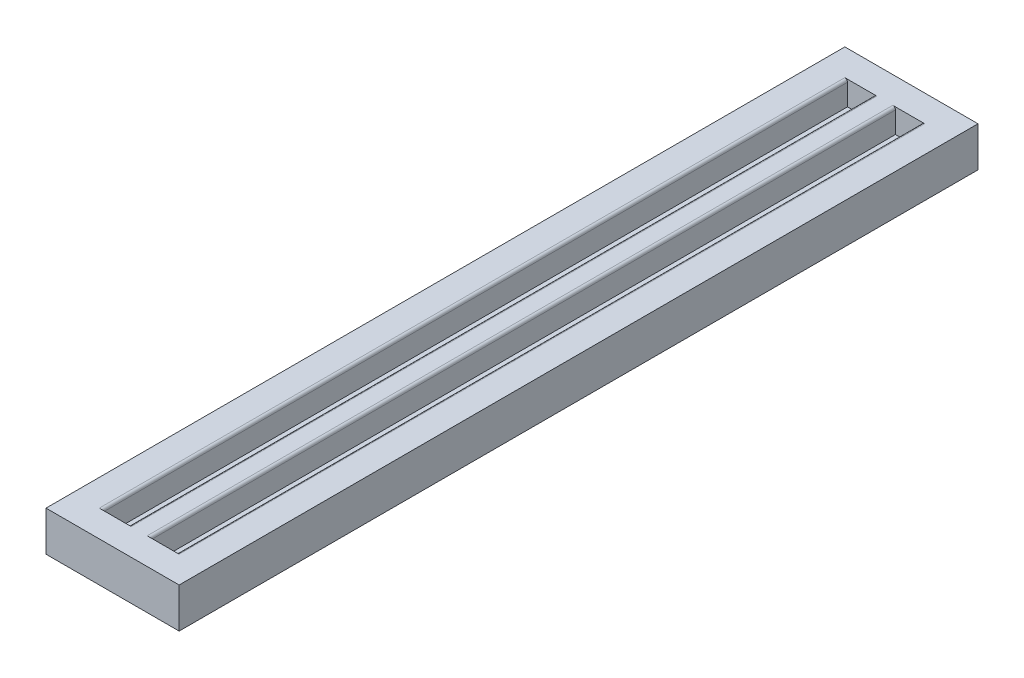
ISO-10303-21;
HEADER;
FILE_DESCRIPTION(('STEP AP214'),'2;1');
FILE_NAME('part.step','',(''),(''),'','','');
FILE_SCHEMA(('AUTOMOTIVE_DESIGN { 1 0 10303 214 1 1 1 1 }'));
ENDSEC;
DATA;
#1=APPLICATION_CONTEXT('core data for automotive mechanical design processes');
#2=APPLICATION_PROTOCOL_DEFINITION('international standard','automotive_design',2000,#1);
#3=PRODUCT_CONTEXT('',#1,'mechanical');
#4=PRODUCT('Part','Part','',(#3));
#5=PRODUCT_RELATED_PRODUCT_CATEGORY('part','',(#4));
#6=PRODUCT_DEFINITION_FORMATION('','',#4);
#7=PRODUCT_DEFINITION_CONTEXT('part definition',#1,'design');
#8=PRODUCT_DEFINITION('design','',#6,#7);
#9=PRODUCT_DEFINITION_SHAPE('','',#8);
#10=(LENGTH_UNIT() NAMED_UNIT(*) SI_UNIT(.MILLI.,.METRE.));
#11=(NAMED_UNIT(*) PLANE_ANGLE_UNIT() SI_UNIT($,.RADIAN.));
#12=(NAMED_UNIT(*) SI_UNIT($,.STERADIAN.) SOLID_ANGLE_UNIT());
#13=UNCERTAINTY_MEASURE_WITH_UNIT(LENGTH_MEASURE(1.E-05),#10,'distance_accuracy_value','');
#14=(GEOMETRIC_REPRESENTATION_CONTEXT(3) GLOBAL_UNCERTAINTY_ASSIGNED_CONTEXT((#13)) GLOBAL_UNIT_ASSIGNED_CONTEXT((#10,
#11,#12)) REPRESENTATION_CONTEXT('',''));
#15=CARTESIAN_POINT('',(0.,0.,0.));
#16=DIRECTION('',(0.,0.,1.));
#17=DIRECTION('',(1.,0.,0.));
#18=AXIS2_PLACEMENT_3D('',#15,#16,#17);
#19=CARTESIAN_POINT('',(125.,37.5,750.));
#20=DIRECTION('',(0.,-1.,0.));
#21=DIRECTION('',(1.,0.,0.));
#22=AXIS2_PLACEMENT_3D('',#19,#20,#21);
#23=PLANE('',#22);
#24=DIRECTION('',(0.,0.,1.));
#25=VECTOR('',#24,1.);
#26=CARTESIAN_POINT('',(-15.,37.5,750.));
#27=LINE('',#26,#25);
#28=CARTESIAN_POINT('',(-15.,37.5,-700.));
#29=VERTEX_POINT('',#28);
#30=CARTESIAN_POINT('',(-15.,37.5,700.));
#31=VERTEX_POINT('',#30);
#32=EDGE_CURVE('E246',#29,#31,#27,.T.);
#33=ORIENTED_EDGE('',*,*,#32,.T.);
#34=DIRECTION('',(-1.,0.,0.));
#35=VECTOR('',#34,1.);
#36=CARTESIAN_POINT('',(-70.,37.5,700.));
#37=LINE('',#36,#35);
#38=CARTESIAN_POINT('',(-75.,37.5,700.));
#39=VERTEX_POINT('',#38);
#40=EDGE_CURVE('E192',#31,#39,#37,.T.);
#41=ORIENTED_EDGE('',*,*,#40,.T.);
#42=DIRECTION('',(0.,0.,1.));
#43=VECTOR('',#42,1.);
#44=CARTESIAN_POINT('',(-75.,37.5,750.));
#45=LINE('',#44,#43);
#46=CARTESIAN_POINT('',(-75.,37.5,-700.));
#47=VERTEX_POINT('',#46);
#48=EDGE_CURVE('E243',#39,#47,#45,.F.);
#49=ORIENTED_EDGE('',*,*,#48,.T.);
#50=DIRECTION('',(-1.,0.,0.));
#51=VECTOR('',#50,1.);
#52=CARTESIAN_POINT('',(-70.,37.5,-700.));
#53=LINE('',#52,#51);
#54=EDGE_CURVE('E198',#29,#47,#53,.T.);
#55=ORIENTED_EDGE('',*,*,#54,.F.);
#56=EDGE_LOOP('',(#33,#41,#49,#55));
#57=FACE_BOUND('',#56,.T.);
#58=DIRECTION('',(-1.,0.,0.));
#59=VECTOR('',#58,1.);
#60=CARTESIAN_POINT('',(125.,37.5,-750.));
#61=LINE('',#60,#59);
#62=CARTESIAN_POINT('',(125.,37.5,-750.));
#63=VERTEX_POINT('',#62);
#64=CARTESIAN_POINT('',(-125.,37.5,-750.));
#65=VERTEX_POINT('',#64);
#66=EDGE_CURVE('E218',#63,#65,#61,.T.);
#67=ORIENTED_EDGE('',*,*,#66,.T.);
#68=DIRECTION('',(0.,0.,-1.));
#69=VECTOR('',#68,1.);
#70=CARTESIAN_POINT('',(-125.,37.5,750.));
#71=LINE('',#70,#69);
#72=CARTESIAN_POINT('',(-125.,37.5,750.));
#73=VERTEX_POINT('',#72);
#74=EDGE_CURVE('E224',#73,#65,#71,.T.);
#75=ORIENTED_EDGE('',*,*,#74,.F.);
#76=DIRECTION('',(-1.,0.,0.));
#77=VECTOR('',#76,1.);
#78=CARTESIAN_POINT('',(125.,37.5,750.));
#79=LINE('',#78,#77);
#80=CARTESIAN_POINT('',(125.,37.5,750.));
#81=VERTEX_POINT('',#80);
#82=EDGE_CURVE('E222',#81,#73,#79,.T.);
#83=ORIENTED_EDGE('',*,*,#82,.F.);
#84=DIRECTION('',(0.,0.,-1.));
#85=VECTOR('',#84,1.);
#86=CARTESIAN_POINT('',(125.,37.5,750.));
#87=LINE('',#86,#85);
#88=EDGE_CURVE('E234',#81,#63,#87,.T.);
#89=ORIENTED_EDGE('',*,*,#88,.T.);
#90=EDGE_LOOP('',(#67,#75,#83,#89));
#91=FACE_BOUND('',#90,.T.);
#92=DIRECTION('',(0.,0.,1.));
#93=VECTOR('',#92,1.);
#94=CARTESIAN_POINT('',(75.,37.5,750.));
#95=LINE('',#94,#93);
#96=CARTESIAN_POINT('',(75.,37.5,-700.));
#97=VERTEX_POINT('',#96);
#98=CARTESIAN_POINT('',(75.,37.5,700.));
#99=VERTEX_POINT('',#98);
#100=EDGE_CURVE('E252',#97,#99,#95,.T.);
#101=ORIENTED_EDGE('',*,*,#100,.T.);
#102=DIRECTION('',(-1.,0.,0.));
#103=VECTOR('',#102,1.);
#104=CARTESIAN_POINT('',(20.,37.5,700.));
#105=LINE('',#104,#103);
#106=CARTESIAN_POINT('',(15.,37.5,700.));
#107=VERTEX_POINT('',#106);
#108=EDGE_CURVE('E160',#99,#107,#105,.T.);
#109=ORIENTED_EDGE('',*,*,#108,.T.);
#110=DIRECTION('',(0.,0.,1.));
#111=VECTOR('',#110,1.);
#112=CARTESIAN_POINT('',(15.,37.5,750.));
#113=LINE('',#112,#111);
#114=CARTESIAN_POINT('',(15.,37.5,-700.));
#115=VERTEX_POINT('',#114);
#116=EDGE_CURVE('E249',#107,#115,#113,.F.);
#117=ORIENTED_EDGE('',*,*,#116,.T.);
#118=DIRECTION('',(-1.,0.,0.));
#119=VECTOR('',#118,1.);
#120=CARTESIAN_POINT('',(20.,37.5,-700.));
#121=LINE('',#120,#119);
#122=EDGE_CURVE('E171',#97,#115,#121,.T.);
#123=ORIENTED_EDGE('',*,*,#122,.F.);
#124=EDGE_LOOP('',(#101,#109,#117,#123));
#125=FACE_BOUND('',#124,.T.);
#126=ADVANCED_FACE('F37',(#57,#91,#125),#23,.F.);
#127=CARTESIAN_POINT('',(-125.,37.5,750.));
#128=DIRECTION('',(1.,0.,0.));
#129=DIRECTION('',(0.,0.,-1.));
#130=AXIS2_PLACEMENT_3D('',#127,#128,#129);
#131=PLANE('',#130);
#132=DIRECTION('',(0.,-1.,0.));
#133=VECTOR('',#132,1.);
#134=CARTESIAN_POINT('',(-125.,37.5,-750.));
#135=LINE('',#134,#133);
#136=CARTESIAN_POINT('',(-125.,-37.5,-750.));
#137=VERTEX_POINT('',#136);
#138=EDGE_CURVE('E211',#65,#137,#135,.T.);
#139=ORIENTED_EDGE('',*,*,#138,.T.);
#140=DIRECTION('',(0.,0.,-1.));
#141=VECTOR('',#140,1.);
#142=CARTESIAN_POINT('',(-125.,-37.5,750.));
#143=LINE('',#142,#141);
#144=CARTESIAN_POINT('',(-125.,-37.5,750.));
#145=VERTEX_POINT('',#144);
#146=EDGE_CURVE('E240',#145,#137,#143,.T.);
#147=ORIENTED_EDGE('',*,*,#146,.F.);
#148=DIRECTION('',(0.,-1.,0.));
#149=VECTOR('',#148,1.);
#150=CARTESIAN_POINT('',(-125.,37.5,750.));
#151=LINE('',#150,#149);
#152=EDGE_CURVE('E214',#73,#145,#151,.T.);
#153=ORIENTED_EDGE('',*,*,#152,.F.);
#154=ORIENTED_EDGE('',*,*,#74,.T.);
#155=EDGE_LOOP('',(#139,#147,#153,#154));
#156=FACE_BOUND('',#155,.T.);
#157=ADVANCED_FACE('F309',(#156),#131,.F.);
#158=CARTESIAN_POINT('',(125.,-37.5,750.));
#159=DIRECTION('',(0.,1.,0.));
#160=DIRECTION('',(-1.,0.,0.));
#161=AXIS2_PLACEMENT_3D('',#158,#159,#160);
#162=PLANE('',#161);
#163=DIRECTION('',(1.,0.,0.));
#164=VECTOR('',#163,1.);
#165=CARTESIAN_POINT('',(125.,-37.5,-750.));
#166=LINE('',#165,#164);
#167=CARTESIAN_POINT('',(125.,-37.5,-750.));
#168=VERTEX_POINT('',#167);
#169=EDGE_CURVE('E227',#137,#168,#166,.T.);
#170=ORIENTED_EDGE('',*,*,#169,.T.);
#171=DIRECTION('',(0.,0.,-1.));
#172=VECTOR('',#171,1.);
#173=CARTESIAN_POINT('',(125.,-37.5,750.));
#174=LINE('',#173,#172);
#175=CARTESIAN_POINT('',(125.,-37.5,750.));
#176=VERTEX_POINT('',#175);
#177=EDGE_CURVE('E237',#176,#168,#174,.T.);
#178=ORIENTED_EDGE('',*,*,#177,.F.);
#179=DIRECTION('',(1.,0.,0.));
#180=VECTOR('',#179,1.);
#181=CARTESIAN_POINT('',(125.,-37.5,750.));
#182=LINE('',#181,#180);
#183=EDGE_CURVE('E217',#145,#176,#182,.T.);
#184=ORIENTED_EDGE('',*,*,#183,.F.);
#185=ORIENTED_EDGE('',*,*,#146,.T.);
#186=EDGE_LOOP('',(#170,#178,#184,#185));
#187=FACE_BOUND('',#186,.T.);
#188=ADVANCED_FACE('F314',(#187),#162,.F.);
#189=CARTESIAN_POINT('',(125.,37.5,750.));
#190=DIRECTION('',(-1.,0.,0.));
#191=DIRECTION('',(0.,0.,1.));
#192=AXIS2_PLACEMENT_3D('',#189,#190,#191);
#193=PLANE('',#192);
#194=DIRECTION('',(0.,1.,0.));
#195=VECTOR('',#194,1.);
#196=CARTESIAN_POINT('',(125.,37.5,-750.));
#197=LINE('',#196,#195);
#198=EDGE_CURVE('E229',#168,#63,#197,.T.);
#199=ORIENTED_EDGE('',*,*,#198,.T.);
#200=ORIENTED_EDGE('',*,*,#88,.F.);
#201=DIRECTION('',(0.,1.,0.));
#202=VECTOR('',#201,1.);
#203=CARTESIAN_POINT('',(125.,37.5,750.));
#204=LINE('',#203,#202);
#205=EDGE_CURVE('E220',#176,#81,#204,.T.);
#206=ORIENTED_EDGE('',*,*,#205,.F.);
#207=ORIENTED_EDGE('',*,*,#177,.T.);
#208=EDGE_LOOP('',(#199,#200,#206,#207));
#209=FACE_BOUND('',#208,.T.);
#210=ADVANCED_FACE('F321',(#209),#193,.F.);
#211=CARTESIAN_POINT('',(-125.,-37.5,750.));
#212=DIRECTION('',(0.,0.,-1.));
#213=DIRECTION('',(-1.,0.,0.));
#214=AXIS2_PLACEMENT_3D('',#211,#212,#213);
#215=PLANE('',#214);
#216=ORIENTED_EDGE('',*,*,#152,.T.);
#217=ORIENTED_EDGE('',*,*,#183,.T.);
#218=ORIENTED_EDGE('',*,*,#205,.T.);
#219=ORIENTED_EDGE('',*,*,#82,.T.);
#220=EDGE_LOOP('',(#216,#217,#218,#219));
#221=FACE_BOUND('',#220,.T.);
#222=ADVANCED_FACE('F324',(#221),#215,.F.);
#223=CARTESIAN_POINT('',(-125.,-37.5,-750.));
#224=DIRECTION('',(0.,0.,-1.));
#225=DIRECTION('',(-1.,0.,0.));
#226=AXIS2_PLACEMENT_3D('',#223,#224,#225);
#227=PLANE('',#226);
#228=ORIENTED_EDGE('',*,*,#138,.F.);
#229=ORIENTED_EDGE('',*,*,#66,.F.);
#230=ORIENTED_EDGE('',*,*,#198,.F.);
#231=ORIENTED_EDGE('',*,*,#169,.F.);
#232=EDGE_LOOP('',(#228,#229,#230,#231));
#233=FACE_BOUND('',#232,.T.);
#234=ADVANCED_FACE('F319',(#233),#227,.T.);
#235=CARTESIAN_POINT('',(-70.,37.5,-700.));
#236=DIRECTION('',(-1.,0.,0.));
#237=DIRECTION('',(0.,0.,1.));
#238=AXIS2_PLACEMENT_3D('',#235,#236,#237);
#239=PLANE('',#238);
#240=DIRECTION('',(0.,-1.,0.));
#241=VECTOR('',#240,1.);
#242=CARTESIAN_POINT('',(-70.,37.5,-700.));
#243=LINE('',#242,#241);
#244=CARTESIAN_POINT('',(-70.,32.5,-700.));
#245=VERTEX_POINT('',#244);
#246=CARTESIAN_POINT('',(-70.,-7.49999999999999,-700.));
#247=VERTEX_POINT('',#246);
#248=EDGE_CURVE('E189',#245,#247,#243,.T.);
#249=ORIENTED_EDGE('',*,*,#248,.F.);
#250=DIRECTION('',(0.,0.,1.));
#251=VECTOR('',#250,1.);
#252=CARTESIAN_POINT('',(-70.,32.5,-700.));
#253=LINE('',#252,#251);
#254=CARTESIAN_POINT('',(-70.,32.5,700.));
#255=VERTEX_POINT('',#254);
#256=EDGE_CURVE('E261',#245,#255,#253,.T.);
#257=ORIENTED_EDGE('',*,*,#256,.T.);
#258=DIRECTION('',(0.,-1.,0.));
#259=VECTOR('',#258,1.);
#260=CARTESIAN_POINT('',(-70.,37.5,700.));
#261=LINE('',#260,#259);
#262=CARTESIAN_POINT('',(-70.,-7.49999999999999,700.));
#263=VERTEX_POINT('',#262);
#264=EDGE_CURVE('E187',#255,#263,#261,.T.);
#265=ORIENTED_EDGE('',*,*,#264,.T.);
#266=DIRECTION('',(0.,0.,1.));
#267=VECTOR('',#266,1.);
#268=CARTESIAN_POINT('',(-70.,-7.49999999999999,-700.));
#269=LINE('',#268,#267);
#270=EDGE_CURVE('E200',#247,#263,#269,.T.);
#271=ORIENTED_EDGE('',*,*,#270,.F.);
#272=EDGE_LOOP('',(#249,#257,#265,#271));
#273=FACE_BOUND('',#272,.T.);
#274=ADVANCED_FACE('F297',(#273),#239,.F.);
#275=CARTESIAN_POINT('',(-20.,37.5,-700.));
#276=DIRECTION('',(1.,0.,0.));
#277=DIRECTION('',(0.,1.,0.));
#278=AXIS2_PLACEMENT_3D('',#275,#276,#277);
#279=PLANE('',#278);
#280=DIRECTION('',(0.,1.,0.));
#281=VECTOR('',#280,1.);
#282=CARTESIAN_POINT('',(-20.,37.5,700.));
#283=LINE('',#282,#281);
#284=CARTESIAN_POINT('',(-20.,-7.49999999999999,700.));
#285=VERTEX_POINT('',#284);
#286=CARTESIAN_POINT('',(-20.,32.5,700.));
#287=VERTEX_POINT('',#286);
#288=EDGE_CURVE('E205',#285,#287,#283,.T.);
#289=ORIENTED_EDGE('',*,*,#288,.T.);
#290=DIRECTION('',(0.,0.,1.));
#291=VECTOR('',#290,1.);
#292=CARTESIAN_POINT('',(-20.,32.5,-700.));
#293=LINE('',#292,#291);
#294=CARTESIAN_POINT('',(-20.,32.5,-700.));
#295=VERTEX_POINT('',#294);
#296=EDGE_CURVE('E259',#287,#295,#293,.F.);
#297=ORIENTED_EDGE('',*,*,#296,.T.);
#298=DIRECTION('',(0.,1.,0.));
#299=VECTOR('',#298,1.);
#300=CARTESIAN_POINT('',(-20.,37.5,-700.));
#301=LINE('',#300,#299);
#302=CARTESIAN_POINT('',(-20.,-7.49999999999999,-700.));
#303=VERTEX_POINT('',#302);
#304=EDGE_CURVE('E195',#303,#295,#301,.T.);
#305=ORIENTED_EDGE('',*,*,#304,.F.);
#306=DIRECTION('',(0.,0.,1.));
#307=VECTOR('',#306,1.);
#308=CARTESIAN_POINT('',(-20.,-7.49999999999999,-700.));
#309=LINE('',#308,#307);
#310=EDGE_CURVE('E209',#303,#285,#309,.T.);
#311=ORIENTED_EDGE('',*,*,#310,.T.);
#312=EDGE_LOOP('',(#289,#297,#305,#311));
#313=FACE_BOUND('',#312,.T.);
#314=ADVANCED_FACE('F290',(#313),#279,.F.);
#315=CARTESIAN_POINT('',(-70.,-7.49999999999999,-700.));
#316=DIRECTION('',(0.,-1.,0.));
#317=DIRECTION('',(0.,0.,-1.));
#318=AXIS2_PLACEMENT_3D('',#315,#316,#317);
#319=PLANE('',#318);
#320=DIRECTION('',(1.,0.,0.));
#321=VECTOR('',#320,1.);
#322=CARTESIAN_POINT('',(-70.,-7.49999999999999,700.));
#323=LINE('',#322,#321);
#324=EDGE_CURVE('E202',#263,#285,#323,.T.);
#325=ORIENTED_EDGE('',*,*,#324,.T.);
#326=ORIENTED_EDGE('',*,*,#310,.F.);
#327=DIRECTION('',(1.,0.,0.));
#328=VECTOR('',#327,1.);
#329=CARTESIAN_POINT('',(-70.,-7.49999999999999,-700.));
#330=LINE('',#329,#328);
#331=EDGE_CURVE('E191',#247,#303,#330,.T.);
#332=ORIENTED_EDGE('',*,*,#331,.F.);
#333=ORIENTED_EDGE('',*,*,#270,.T.);
#334=EDGE_LOOP('',(#325,#326,#332,#333));
#335=FACE_BOUND('',#334,.T.);
#336=ADVANCED_FACE('F294',(#335),#319,.F.);
#337=CARTESIAN_POINT('',(-70.,-7.49999999999999,-700.));
#338=DIRECTION('',(0.,0.,1.));
#339=DIRECTION('',(1.,0.,0.));
#340=AXIS2_PLACEMENT_3D('',#337,#338,#339);
#341=PLANE('',#340);
#342=ORIENTED_EDGE('',*,*,#54,.T.);
#343=CARTESIAN_POINT('',(-75.,32.5,-700.));
#344=DIRECTION('',(0.,0.,1.));
#345=DIRECTION('',(1.,0.,0.));
#346=AXIS2_PLACEMENT_3D('',#343,#344,#345);
#347=CIRCLE('',#346,5.);
#348=EDGE_CURVE('E11',#47,#245,#347,.F.);
#349=ORIENTED_EDGE('',*,*,#348,.T.);
#350=ORIENTED_EDGE('',*,*,#248,.T.);
#351=ORIENTED_EDGE('',*,*,#331,.T.);
#352=ORIENTED_EDGE('',*,*,#304,.T.);
#353=CARTESIAN_POINT('',(-15.,32.5,-700.));
#354=DIRECTION('',(0.,0.,1.));
#355=DIRECTION('',(1.,0.,0.));
#356=AXIS2_PLACEMENT_3D('',#353,#354,#355);
#357=CIRCLE('',#356,5.);
#358=EDGE_CURVE('E274',#295,#29,#357,.F.);
#359=ORIENTED_EDGE('',*,*,#358,.T.);
#360=EDGE_LOOP('',(#342,#349,#350,#351,#352,#359));
#361=FACE_BOUND('',#360,.T.);
#362=ADVANCED_FACE('F298',(#361),#341,.T.);
#363=CARTESIAN_POINT('',(-70.,-7.49999999999999,700.));
#364=DIRECTION('',(0.,0.,1.));
#365=DIRECTION('',(1.,0.,0.));
#366=AXIS2_PLACEMENT_3D('',#363,#364,#365);
#367=PLANE('',#366);
#368=ORIENTED_EDGE('',*,*,#264,.F.);
#369=CARTESIAN_POINT('',(-75.,32.5,700.));
#370=DIRECTION('',(0.,0.,1.));
#371=DIRECTION('',(1.,0.,0.));
#372=AXIS2_PLACEMENT_3D('',#369,#370,#371);
#373=CIRCLE('',#372,5.);
#374=EDGE_CURVE('E45',#255,#39,#373,.T.);
#375=ORIENTED_EDGE('',*,*,#374,.T.);
#376=ORIENTED_EDGE('',*,*,#40,.F.);
#377=CARTESIAN_POINT('',(-15.,32.5,700.));
#378=DIRECTION('',(0.,0.,1.));
#379=DIRECTION('',(1.,0.,0.));
#380=AXIS2_PLACEMENT_3D('',#377,#378,#379);
#381=CIRCLE('',#380,5.);
#382=EDGE_CURVE('E272',#31,#287,#381,.T.);
#383=ORIENTED_EDGE('',*,*,#382,.T.);
#384=ORIENTED_EDGE('',*,*,#288,.F.);
#385=ORIENTED_EDGE('',*,*,#324,.F.);
#386=EDGE_LOOP('',(#368,#375,#376,#383,#384,#385));
#387=FACE_BOUND('',#386,.T.);
#388=ADVANCED_FACE('F278',(#387),#367,.F.);
#389=CARTESIAN_POINT('',(20.,37.5,-700.));
#390=DIRECTION('',(-1.,0.,0.));
#391=DIRECTION('',(0.,-1.,0.));
#392=AXIS2_PLACEMENT_3D('',#389,#390,#391);
#393=PLANE('',#392);
#394=DIRECTION('',(0.,-1.,0.));
#395=VECTOR('',#394,1.);
#396=CARTESIAN_POINT('',(20.,37.5,-700.));
#397=LINE('',#396,#395);
#398=CARTESIAN_POINT('',(20.,32.5,-700.));
#399=VERTEX_POINT('',#398);
#400=CARTESIAN_POINT('',(20.,-7.49999999999998,-700.));
#401=VERTEX_POINT('',#400);
#402=EDGE_CURVE('E149',#399,#401,#397,.T.);
#403=ORIENTED_EDGE('',*,*,#402,.F.);
#404=DIRECTION('',(0.,0.,1.));
#405=VECTOR('',#404,1.);
#406=CARTESIAN_POINT('',(20.,32.5,-700.));
#407=LINE('',#406,#405);
#408=CARTESIAN_POINT('',(20.,32.5,700.));
#409=VERTEX_POINT('',#408);
#410=EDGE_CURVE('E257',#399,#409,#407,.T.);
#411=ORIENTED_EDGE('',*,*,#410,.T.);
#412=DIRECTION('',(0.,-1.,0.));
#413=VECTOR('',#412,1.);
#414=CARTESIAN_POINT('',(20.,37.5,700.));
#415=LINE('',#414,#413);
#416=CARTESIAN_POINT('',(20.,-7.49999999999998,700.));
#417=VERTEX_POINT('',#416);
#418=EDGE_CURVE('E166',#409,#417,#415,.T.);
#419=ORIENTED_EDGE('',*,*,#418,.T.);
#420=DIRECTION('',(0.,0.,1.));
#421=VECTOR('',#420,1.);
#422=CARTESIAN_POINT('',(20.,-7.49999999999998,-700.));
#423=LINE('',#422,#421);
#424=EDGE_CURVE('E163',#401,#417,#423,.T.);
#425=ORIENTED_EDGE('',*,*,#424,.F.);
#426=EDGE_LOOP('',(#403,#411,#419,#425));
#427=FACE_BOUND('',#426,.T.);
#428=ADVANCED_FACE('F164',(#427),#393,.F.);
#429=CARTESIAN_POINT('',(70.,37.5,-700.));
#430=DIRECTION('',(1.,0.,0.));
#431=DIRECTION('',(0.,0.,-1.));
#432=AXIS2_PLACEMENT_3D('',#429,#430,#431);
#433=PLANE('',#432);
#434=DIRECTION('',(0.,1.,0.));
#435=VECTOR('',#434,1.);
#436=CARTESIAN_POINT('',(70.,37.5,700.));
#437=LINE('',#436,#435);
#438=CARTESIAN_POINT('',(70.,-7.49999999999997,700.));
#439=VERTEX_POINT('',#438);
#440=CARTESIAN_POINT('',(70.,32.5,700.));
#441=VERTEX_POINT('',#440);
#442=EDGE_CURVE('E183',#439,#441,#437,.T.);
#443=ORIENTED_EDGE('',*,*,#442,.T.);
#444=DIRECTION('',(0.,0.,1.));
#445=VECTOR('',#444,1.);
#446=CARTESIAN_POINT('',(70.,32.5,-700.));
#447=LINE('',#446,#445);
#448=CARTESIAN_POINT('',(70.,32.5,-700.));
#449=VERTEX_POINT('',#448);
#450=EDGE_CURVE('E255',#441,#449,#447,.F.);
#451=ORIENTED_EDGE('',*,*,#450,.T.);
#452=DIRECTION('',(0.,1.,0.));
#453=VECTOR('',#452,1.);
#454=CARTESIAN_POINT('',(70.,37.5,-700.));
#455=LINE('',#454,#453);
#456=CARTESIAN_POINT('',(70.,-7.49999999999997,-700.));
#457=VERTEX_POINT('',#456);
#458=EDGE_CURVE('E175',#457,#449,#455,.T.);
#459=ORIENTED_EDGE('',*,*,#458,.F.);
#460=DIRECTION('',(0.,0.,1.));
#461=VECTOR('',#460,1.);
#462=CARTESIAN_POINT('',(70.,-7.49999999999997,-700.));
#463=LINE('',#462,#461);
#464=EDGE_CURVE('E170',#457,#439,#463,.T.);
#465=ORIENTED_EDGE('',*,*,#464,.T.);
#466=EDGE_LOOP('',(#443,#451,#459,#465));
#467=FACE_BOUND('',#466,.T.);
#468=ADVANCED_FACE('F389',(#467),#433,.F.);
#469=CARTESIAN_POINT('',(20.,-7.49999999999998,-700.));
#470=DIRECTION('',(0.,-1.,0.));
#471=DIRECTION('',(1.,0.,0.));
#472=AXIS2_PLACEMENT_3D('',#469,#470,#471);
#473=PLANE('',#472);
#474=DIRECTION('',(1.,0.,0.));
#475=VECTOR('',#474,1.);
#476=CARTESIAN_POINT('',(20.,-7.49999999999998,700.));
#477=LINE('',#476,#475);
#478=EDGE_CURVE('E181',#417,#439,#477,.T.);
#479=ORIENTED_EDGE('',*,*,#478,.T.);
#480=ORIENTED_EDGE('',*,*,#464,.F.);
#481=DIRECTION('',(1.,0.,0.));
#482=VECTOR('',#481,1.);
#483=CARTESIAN_POINT('',(20.,-7.49999999999998,-700.));
#484=LINE('',#483,#482);
#485=EDGE_CURVE('E154',#401,#457,#484,.T.);
#486=ORIENTED_EDGE('',*,*,#485,.F.);
#487=ORIENTED_EDGE('',*,*,#424,.T.);
#488=EDGE_LOOP('',(#479,#480,#486,#487));
#489=FACE_BOUND('',#488,.T.);
#490=ADVANCED_FACE('F173',(#489),#473,.F.);
#491=CARTESIAN_POINT('',(20.,-7.49999999999998,-700.));
#492=DIRECTION('',(0.,0.,1.));
#493=DIRECTION('',(1.,0.,0.));
#494=AXIS2_PLACEMENT_3D('',#491,#492,#493);
#495=PLANE('',#494);
#496=ORIENTED_EDGE('',*,*,#122,.T.);
#497=CARTESIAN_POINT('',(15.,32.5,-700.));
#498=DIRECTION('',(0.,0.,1.));
#499=DIRECTION('',(1.,0.,0.));
#500=AXIS2_PLACEMENT_3D('',#497,#498,#499);
#501=CIRCLE('',#500,5.);
#502=EDGE_CURVE('E156',#115,#399,#501,.F.);
#503=ORIENTED_EDGE('',*,*,#502,.T.);
#504=ORIENTED_EDGE('',*,*,#402,.T.);
#505=ORIENTED_EDGE('',*,*,#485,.T.);
#506=ORIENTED_EDGE('',*,*,#458,.T.);
#507=CARTESIAN_POINT('',(75.,32.5,-700.));
#508=DIRECTION('',(0.,0.,1.));
#509=DIRECTION('',(1.,0.,0.));
#510=AXIS2_PLACEMENT_3D('',#507,#508,#509);
#511=CIRCLE('',#510,5.);
#512=EDGE_CURVE('E265',#449,#97,#511,.F.);
#513=ORIENTED_EDGE('',*,*,#512,.T.);
#514=EDGE_LOOP('',(#496,#503,#504,#505,#506,#513));
#515=FACE_BOUND('',#514,.T.);
#516=ADVANCED_FACE('F151',(#515),#495,.T.);
#517=CARTESIAN_POINT('',(20.,-7.49999999999998,700.));
#518=DIRECTION('',(0.,0.,1.));
#519=DIRECTION('',(1.,0.,0.));
#520=AXIS2_PLACEMENT_3D('',#517,#518,#519);
#521=PLANE('',#520);
#522=ORIENTED_EDGE('',*,*,#418,.F.);
#523=CARTESIAN_POINT('',(15.,32.5,700.));
#524=DIRECTION('',(0.,0.,1.));
#525=DIRECTION('',(1.,0.,0.));
#526=AXIS2_PLACEMENT_3D('',#523,#524,#525);
#527=CIRCLE('',#526,5.);
#528=EDGE_CURVE('E268',#409,#107,#527,.T.);
#529=ORIENTED_EDGE('',*,*,#528,.T.);
#530=ORIENTED_EDGE('',*,*,#108,.F.);
#531=CARTESIAN_POINT('',(75.,32.5,700.));
#532=DIRECTION('',(0.,0.,1.));
#533=DIRECTION('',(1.,0.,0.));
#534=AXIS2_PLACEMENT_3D('',#531,#532,#533);
#535=CIRCLE('',#534,5.);
#536=EDGE_CURVE('E263',#99,#441,#535,.T.);
#537=ORIENTED_EDGE('',*,*,#536,.T.);
#538=ORIENTED_EDGE('',*,*,#442,.F.);
#539=ORIENTED_EDGE('',*,*,#478,.F.);
#540=EDGE_LOOP('',(#522,#529,#530,#537,#538,#539));
#541=FACE_BOUND('',#540,.T.);
#542=ADVANCED_FACE('F333',(#541),#521,.F.);
#543=CARTESIAN_POINT('',(75.,32.5,750.));
#544=DIRECTION('',(0.,0.,1.));
#545=DIRECTION('',(1.,0.,0.));
#546=AXIS2_PLACEMENT_3D('',#543,#544,#545);
#547=CYLINDRICAL_SURFACE('',#546,5.);
#548=ORIENTED_EDGE('',*,*,#512,.F.);
#549=ORIENTED_EDGE('',*,*,#450,.F.);
#550=ORIENTED_EDGE('',*,*,#536,.F.);
#551=ORIENTED_EDGE('',*,*,#100,.F.);
#552=EDGE_LOOP('',(#548,#549,#550,#551));
#553=FACE_BOUND('',#552,.T.);
#554=ADVANCED_FACE('F329',(#553),#547,.T.);
#555=CARTESIAN_POINT('',(15.,32.5,-700.));
#556=DIRECTION('',(0.,0.,1.));
#557=DIRECTION('',(1.,0.,0.));
#558=AXIS2_PLACEMENT_3D('',#555,#556,#557);
#559=CYLINDRICAL_SURFACE('',#558,5.);
#560=ORIENTED_EDGE('',*,*,#502,.F.);
#561=ORIENTED_EDGE('',*,*,#116,.F.);
#562=ORIENTED_EDGE('',*,*,#528,.F.);
#563=ORIENTED_EDGE('',*,*,#410,.F.);
#564=EDGE_LOOP('',(#560,#561,#562,#563));
#565=FACE_BOUND('',#564,.T.);
#566=ADVANCED_FACE('F332',(#565),#559,.T.);
#567=CARTESIAN_POINT('',(-15.,32.5,750.));
#568=DIRECTION('',(0.,0.,1.));
#569=DIRECTION('',(1.,0.,0.));
#570=AXIS2_PLACEMENT_3D('',#567,#568,#569);
#571=CYLINDRICAL_SURFACE('',#570,5.);
#572=ORIENTED_EDGE('',*,*,#358,.F.);
#573=ORIENTED_EDGE('',*,*,#296,.F.);
#574=ORIENTED_EDGE('',*,*,#382,.F.);
#575=ORIENTED_EDGE('',*,*,#32,.F.);
#576=EDGE_LOOP('',(#572,#573,#574,#575));
#577=FACE_BOUND('',#576,.T.);
#578=ADVANCED_FACE('F286',(#577),#571,.T.);
#579=CARTESIAN_POINT('',(-75.,32.5,-700.));
#580=DIRECTION('',(0.,0.,1.));
#581=DIRECTION('',(1.,0.,0.));
#582=AXIS2_PLACEMENT_3D('',#579,#580,#581);
#583=CYLINDRICAL_SURFACE('',#582,5.);
#584=ORIENTED_EDGE('',*,*,#348,.F.);
#585=ORIENTED_EDGE('',*,*,#48,.F.);
#586=ORIENTED_EDGE('',*,*,#374,.F.);
#587=ORIENTED_EDGE('',*,*,#256,.F.);
#588=EDGE_LOOP('',(#584,#585,#586,#587));
#589=FACE_BOUND('',#588,.T.);
#590=ADVANCED_FACE('F39',(#589),#583,.T.);
#591=CLOSED_SHELL('',(#126,#157,#188,#210,#222,#234,#274,#314,#336,#362,#388,#428,#468,#490,
#516,#542,#554,#566,#578,#590));
#592=MANIFOLD_SOLID_BREP('B2',#591);
#593=ADVANCED_BREP_SHAPE_REPRESENTATION('',(#18,#592),#14);
#594=SHAPE_DEFINITION_REPRESENTATION(#9,#593);
ENDSEC;
END-ISO-10303-21;
